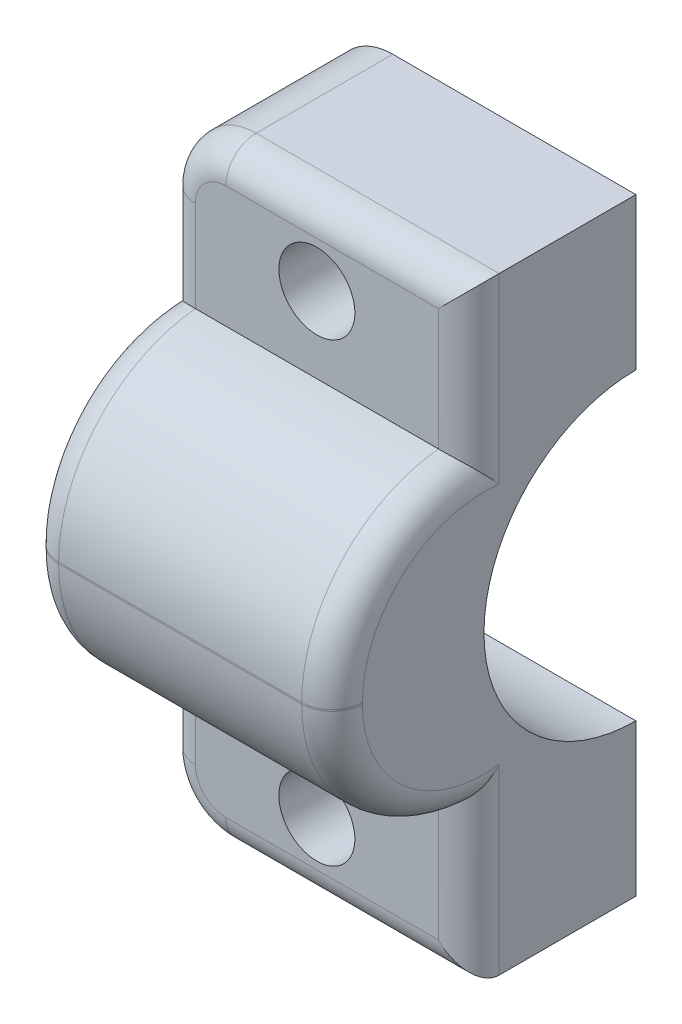
ISO-10303-21;
HEADER;
FILE_DESCRIPTION(('STEP AP214'),'2;1');
FILE_NAME('part.step','',(''),(''),'','','');
FILE_SCHEMA(('AUTOMOTIVE_DESIGN { 1 0 10303 214 1 1 1 1 }'));
ENDSEC;
DATA;
#1=APPLICATION_CONTEXT('core data for automotive mechanical design processes');
#2=APPLICATION_PROTOCOL_DEFINITION('international standard','automotive_design',2000,#1);
#3=PRODUCT_CONTEXT('',#1,'mechanical');
#4=PRODUCT('Part','Part','',(#3));
#5=PRODUCT_RELATED_PRODUCT_CATEGORY('part','',(#4));
#6=PRODUCT_DEFINITION_FORMATION('','',#4);
#7=PRODUCT_DEFINITION_CONTEXT('part definition',#1,'design');
#8=PRODUCT_DEFINITION('design','',#6,#7);
#9=PRODUCT_DEFINITION_SHAPE('','',#8);
#10=(LENGTH_UNIT() NAMED_UNIT(*) SI_UNIT(.MILLI.,.METRE.));
#11=(NAMED_UNIT(*) PLANE_ANGLE_UNIT() SI_UNIT($,.RADIAN.));
#12=(NAMED_UNIT(*) SI_UNIT($,.STERADIAN.) SOLID_ANGLE_UNIT());
#13=UNCERTAINTY_MEASURE_WITH_UNIT(LENGTH_MEASURE(1.E-05),#10,'distance_accuracy_value','');
#14=(GEOMETRIC_REPRESENTATION_CONTEXT(3) GLOBAL_UNCERTAINTY_ASSIGNED_CONTEXT((#13)) GLOBAL_UNIT_ASSIGNED_CONTEXT((#10,
#11,#12)) REPRESENTATION_CONTEXT('',''));
#15=CARTESIAN_POINT('',(0.,0.,0.));
#16=DIRECTION('',(0.,0.,1.));
#17=DIRECTION('',(1.,0.,0.));
#18=AXIS2_PLACEMENT_3D('',#15,#16,#17);
#19=CARTESIAN_POINT('',(0.,0.,30.));
#20=DIRECTION('',(0.,0.,1.));
#21=DIRECTION('',(1.,0.,0.));
#22=AXIS2_PLACEMENT_3D('',#19,#20,#21);
#23=PLANE('',#22);
#24=DIRECTION('',(-1.,0.,0.));
#25=VECTOR('',#24,1.);
#26=CARTESIAN_POINT('',(-110.,0.0250628144669108,30.));
#27=LINE('',#26,#25);
#28=CARTESIAN_POINT('',(-101.,0.0250628144669108,30.));
#29=VERTEX_POINT('',#28);
#30=CARTESIAN_POINT('',(-109.,0.0250628144669108,30.));
#31=VERTEX_POINT('',#30);
#32=EDGE_CURVE('E196',#29,#31,#27,.T.);
#33=ORIENTED_EDGE('',*,*,#32,.T.);
#34=DIRECTION('',(0.,-1.,0.));
#35=VECTOR('',#34,1.);
#36=CARTESIAN_POINT('',(-109.,0.,30.));
#37=LINE('',#36,#35);
#38=CARTESIAN_POINT('',(-109.,-0.0250628144669108,30.));
#39=VERTEX_POINT('',#38);
#40=EDGE_CURVE('E277',#31,#39,#37,.T.);
#41=ORIENTED_EDGE('',*,*,#40,.T.);
#42=DIRECTION('',(-1.,0.,0.));
#43=VECTOR('',#42,1.);
#44=CARTESIAN_POINT('',(-100.,-0.0250628144669108,30.));
#45=LINE('',#44,#43);
#46=CARTESIAN_POINT('',(-101.,-0.0250628144669108,30.));
#47=VERTEX_POINT('',#46);
#48=EDGE_CURVE('E241',#39,#47,#45,.F.);
#49=ORIENTED_EDGE('',*,*,#48,.T.);
#50=DIRECTION('',(0.,1.,0.));
#51=VECTOR('',#50,1.);
#52=CARTESIAN_POINT('',(-101.,0.0250628144669116,30.));
#53=LINE('',#52,#51);
#54=EDGE_CURVE('E274',#47,#29,#53,.T.);
#55=ORIENTED_EDGE('',*,*,#54,.T.);
#56=EDGE_LOOP('',(#33,#41,#49,#55));
#57=FACE_BOUND('',#56,.T.);
#58=ADVANCED_FACE('F46',(#57),#23,.T.);
#59=CARTESIAN_POINT('',(-100.,10.,30.));
#60=DIRECTION('',(-1.,0.,0.));
#61=DIRECTION('',(0.,0.,1.));
#62=AXIS2_PLACEMENT_3D('',#59,#60,#61);
#63=PLANE('',#62);
#64=CARTESIAN_POINT('',(-100.,-0.0250628144669108,25.));
#65=DIRECTION('',(-1.,0.,0.));
#66=DIRECTION('',(0.,0.,1.));
#67=AXIS2_PLACEMENT_3D('',#64,#65,#66);
#68=CIRCLE('',#67,4.);
#69=CARTESIAN_POINT('',(-100.,-0.0250628144669108,29.));
#70=VERTEX_POINT('',#69);
#71=CARTESIAN_POINT('',(-100.,-3.99368978106381,24.5000000000001));
#72=VERTEX_POINT('',#71);
#73=EDGE_CURVE('E289',#70,#72,#68,.F.);
#74=ORIENTED_EDGE('',*,*,#73,.T.);
#75=DIRECTION('',(0.,-1.,0.));
#76=VECTOR('',#75,1.);
#77=CARTESIAN_POINT('',(-100.,10.,24.5000000000001));
#78=LINE('',#77,#76);
#79=CARTESIAN_POINT('',(-100.,-10.,24.5000000000001));
#80=VERTEX_POINT('',#79);
#81=EDGE_CURVE('E292',#72,#80,#78,.T.);
#82=ORIENTED_EDGE('',*,*,#81,.T.);
#83=DIRECTION('',(0.,0.,-1.));
#84=VECTOR('',#83,1.);
#85=CARTESIAN_POINT('',(-100.,-10.,30.));
#86=LINE('',#85,#84);
#87=CARTESIAN_POINT('',(-100.,-10.,20.));
#88=VERTEX_POINT('',#87);
#89=EDGE_CURVE('E216',#80,#88,#86,.T.);
#90=ORIENTED_EDGE('',*,*,#89,.T.);
#91=DIRECTION('',(0.,1.,0.));
#92=VECTOR('',#91,1.);
#93=CARTESIAN_POINT('',(-100.,10.,20.));
#94=LINE('',#93,#92);
#95=CARTESIAN_POINT('',(-100.,-5.,20.));
#96=VERTEX_POINT('',#95);
#97=EDGE_CURVE('E543',#88,#96,#94,.T.);
#98=ORIENTED_EDGE('',*,*,#97,.T.);
#99=CARTESIAN_POINT('',(-100.,0.,20.));
#100=DIRECTION('',(-1.,0.,0.));
#101=DIRECTION('',(0.,0.,1.));
#102=AXIS2_PLACEMENT_3D('',#99,#100,#101);
#103=CIRCLE('',#102,5.);
#104=CARTESIAN_POINT('',(-100.,5.,20.));
#105=VERTEX_POINT('',#104);
#106=EDGE_CURVE('E225',#96,#105,#103,.T.);
#107=ORIENTED_EDGE('',*,*,#106,.T.);
#108=CARTESIAN_POINT('',(-100.,10.,20.));
#109=VERTEX_POINT('',#108);
#110=EDGE_CURVE('E548',#105,#109,#94,.T.);
#111=ORIENTED_EDGE('',*,*,#110,.T.);
#112=DIRECTION('',(0.,0.,-1.));
#113=VECTOR('',#112,1.);
#114=CARTESIAN_POINT('',(-100.,10.,30.));
#115=LINE('',#114,#113);
#116=CARTESIAN_POINT('',(-100.,10.,24.5000000000001));
#117=VERTEX_POINT('',#116);
#118=EDGE_CURVE('E222',#117,#109,#115,.T.);
#119=ORIENTED_EDGE('',*,*,#118,.F.);
#120=DIRECTION('',(0.,1.,0.));
#121=VECTOR('',#120,1.);
#122=CARTESIAN_POINT('',(-100.,10.,24.5000000000001));
#123=LINE('',#122,#121);
#124=CARTESIAN_POINT('',(-100.,3.99368978106381,24.5000000000001));
#125=VERTEX_POINT('',#124);
#126=EDGE_CURVE('E280',#117,#125,#123,.F.);
#127=ORIENTED_EDGE('',*,*,#126,.T.);
#128=CARTESIAN_POINT('',(-100.,0.0250628144669108,25.));
#129=DIRECTION('',(-1.,0.,0.));
#130=DIRECTION('',(0.,0.,1.));
#131=AXIS2_PLACEMENT_3D('',#128,#129,#130);
#132=CIRCLE('',#131,4.);
#133=CARTESIAN_POINT('',(-100.,0.0250628144669108,29.));
#134=VERTEX_POINT('',#133);
#135=EDGE_CURVE('E283',#125,#134,#132,.F.);
#136=ORIENTED_EDGE('',*,*,#135,.T.);
#137=DIRECTION('',(0.,1.,0.));
#138=VECTOR('',#137,1.);
#139=CARTESIAN_POINT('',(-100.,-0.0250628144669108,29.));
#140=LINE('',#139,#138);
#141=EDGE_CURVE('E286',#134,#70,#140,.F.);
#142=ORIENTED_EDGE('',*,*,#141,.T.);
#143=EDGE_LOOP('',(#74,#82,#90,#98,#107,#111,#119,#127,#136,#142));
#144=FACE_BOUND('',#143,.T.);
#145=ADVANCED_FACE('F428',(#144),#63,.F.);
#146=CARTESIAN_POINT('',(-110.,-10.,0.));
#147=DIRECTION('',(-1.,0.,0.));
#148=DIRECTION('',(0.,0.,1.));
#149=AXIS2_PLACEMENT_3D('',#146,#147,#148);
#150=PLANE('',#149);
#151=DIRECTION('',(0.,0.,-1.));
#152=VECTOR('',#151,1.);
#153=CARTESIAN_POINT('',(-110.,-8.,0.));
#154=LINE('',#153,#152);
#155=CARTESIAN_POINT('',(-110.,-8.,20.));
#156=VERTEX_POINT('',#155);
#157=CARTESIAN_POINT('',(-110.,-8.,24.5000000000001));
#158=VERTEX_POINT('',#157);
#159=EDGE_CURVE('E203',#156,#158,#154,.F.);
#160=ORIENTED_EDGE('',*,*,#159,.T.);
#161=DIRECTION('',(0.,1.,0.));
#162=VECTOR('',#161,1.);
#163=CARTESIAN_POINT('',(-110.,-5.,24.5000000000001));
#164=LINE('',#163,#162);
#165=CARTESIAN_POINT('',(-110.,-3.99368978106381,24.5000000000001));
#166=VERTEX_POINT('',#165);
#167=EDGE_CURVE('E264',#158,#166,#164,.T.);
#168=ORIENTED_EDGE('',*,*,#167,.T.);
#169=CARTESIAN_POINT('',(-110.,-0.0250628144669108,25.));
#170=DIRECTION('',(-1.,0.,0.));
#171=DIRECTION('',(0.,0.,1.));
#172=AXIS2_PLACEMENT_3D('',#169,#170,#171);
#173=CIRCLE('',#172,4.);
#174=CARTESIAN_POINT('',(-110.,-0.0250628144669108,29.));
#175=VERTEX_POINT('',#174);
#176=EDGE_CURVE('E261',#166,#175,#173,.T.);
#177=ORIENTED_EDGE('',*,*,#176,.T.);
#178=DIRECTION('',(0.,-1.,0.));
#179=VECTOR('',#178,1.);
#180=CARTESIAN_POINT('',(-110.,-10.,29.));
#181=LINE('',#180,#179);
#182=CARTESIAN_POINT('',(-110.,0.0250628144669108,29.));
#183=VERTEX_POINT('',#182);
#184=EDGE_CURVE('E258',#175,#183,#181,.F.);
#185=ORIENTED_EDGE('',*,*,#184,.T.);
#186=CARTESIAN_POINT('',(-110.,0.0250628144669108,25.));
#187=DIRECTION('',(-1.,0.,0.));
#188=DIRECTION('',(0.,0.,1.));
#189=AXIS2_PLACEMENT_3D('',#186,#187,#188);
#190=CIRCLE('',#189,4.);
#191=CARTESIAN_POINT('',(-110.,3.99368978106381,24.5000000000001));
#192=VERTEX_POINT('',#191);
#193=EDGE_CURVE('E254',#183,#192,#190,.T.);
#194=ORIENTED_EDGE('',*,*,#193,.T.);
#195=DIRECTION('',(0.,-1.,0.));
#196=VECTOR('',#195,1.);
#197=CARTESIAN_POINT('',(-110.,8.,24.5000000000001));
#198=LINE('',#197,#196);
#199=CARTESIAN_POINT('',(-110.,8.,24.5000000000001));
#200=VERTEX_POINT('',#199);
#201=EDGE_CURVE('E251',#192,#200,#198,.F.);
#202=ORIENTED_EDGE('',*,*,#201,.T.);
#203=DIRECTION('',(0.,0.,-1.));
#204=VECTOR('',#203,1.);
#205=CARTESIAN_POINT('',(-110.,8.,0.));
#206=LINE('',#205,#204);
#207=CARTESIAN_POINT('',(-110.,8.,20.));
#208=VERTEX_POINT('',#207);
#209=EDGE_CURVE('E215',#200,#208,#206,.T.);
#210=ORIENTED_EDGE('',*,*,#209,.T.);
#211=DIRECTION('',(0.,1.,0.));
#212=VECTOR('',#211,1.);
#213=CARTESIAN_POINT('',(-110.,10.,20.));
#214=LINE('',#213,#212);
#215=CARTESIAN_POINT('',(-110.,5.,20.));
#216=VERTEX_POINT('',#215);
#217=EDGE_CURVE('E210',#216,#208,#214,.T.);
#218=ORIENTED_EDGE('',*,*,#217,.F.);
#219=CARTESIAN_POINT('',(-110.,0.,20.));
#220=DIRECTION('',(-1.,0.,0.));
#221=DIRECTION('',(0.,0.,1.));
#222=AXIS2_PLACEMENT_3D('',#219,#220,#221);
#223=CIRCLE('',#222,5.);
#224=CARTESIAN_POINT('',(-110.,-5.,20.));
#225=VERTEX_POINT('',#224);
#226=EDGE_CURVE('E207',#225,#216,#223,.T.);
#227=ORIENTED_EDGE('',*,*,#226,.F.);
#228=EDGE_CURVE('E189',#156,#225,#214,.T.);
#229=ORIENTED_EDGE('',*,*,#228,.F.);
#230=EDGE_LOOP('',(#160,#168,#177,#185,#194,#202,#210,#218,#227,#229));
#231=FACE_BOUND('',#230,.T.);
#232=ADVANCED_FACE('F202',(#231),#150,.T.);
#233=CARTESIAN_POINT('',(-108.,8.,0.));
#234=DIRECTION('',(0.,0.,-1.));
#235=DIRECTION('',(-1.,0.,0.));
#236=AXIS2_PLACEMENT_3D('',#233,#234,#235);
#237=CYLINDRICAL_SURFACE('',#236,2.);
#238=ORIENTED_EDGE('',*,*,#209,.F.);
#239=CARTESIAN_POINT('',(-108.,8.,24.5000000000001));
#240=DIRECTION('',(0.,0.,-1.));
#241=DIRECTION('',(-1.,0.,0.));
#242=AXIS2_PLACEMENT_3D('',#239,#240,#241);
#243=CIRCLE('',#242,2.);
#244=CARTESIAN_POINT('',(-108.,10.,24.5000000000001));
#245=VERTEX_POINT('',#244);
#246=EDGE_CURVE('E310',#200,#245,#243,.T.);
#247=ORIENTED_EDGE('',*,*,#246,.T.);
#248=DIRECTION('',(0.,0.,-1.));
#249=VECTOR('',#248,1.);
#250=CARTESIAN_POINT('',(-108.,10.,0.));
#251=LINE('',#250,#249);
#252=CARTESIAN_POINT('',(-108.,10.,20.));
#253=VERTEX_POINT('',#252);
#254=EDGE_CURVE('E220',#253,#245,#251,.F.);
#255=ORIENTED_EDGE('',*,*,#254,.F.);
#256=CARTESIAN_POINT('',(-108.,8.,20.));
#257=DIRECTION('',(0.,0.,1.));
#258=DIRECTION('',(1.,0.,0.));
#259=AXIS2_PLACEMENT_3D('',#256,#257,#258);
#260=CIRCLE('',#259,2.);
#261=EDGE_CURVE('E551',#208,#253,#260,.F.);
#262=ORIENTED_EDGE('',*,*,#261,.F.);
#263=EDGE_LOOP('',(#238,#247,#255,#262));
#264=FACE_BOUND('',#263,.T.);
#265=ADVANCED_FACE('F448',(#264),#237,.T.);
#266=CARTESIAN_POINT('',(-108.,-8.,0.));
#267=DIRECTION('',(0.,0.,-1.));
#268=DIRECTION('',(-1.,0.,0.));
#269=AXIS2_PLACEMENT_3D('',#266,#267,#268);
#270=CYLINDRICAL_SURFACE('',#269,2.);
#271=DIRECTION('',(0.,0.,-1.));
#272=VECTOR('',#271,1.);
#273=CARTESIAN_POINT('',(-108.,-10.,0.));
#274=LINE('',#273,#272);
#275=CARTESIAN_POINT('',(-108.,-10.,24.5000000000001));
#276=VERTEX_POINT('',#275);
#277=CARTESIAN_POINT('',(-108.,-10.,20.));
#278=VERTEX_POINT('',#277);
#279=EDGE_CURVE('E197',#276,#278,#274,.T.);
#280=ORIENTED_EDGE('',*,*,#279,.F.);
#281=CARTESIAN_POINT('',(-108.,-8.,24.5000000000001));
#282=DIRECTION('',(0.,0.,-1.));
#283=DIRECTION('',(-1.,0.,0.));
#284=AXIS2_PLACEMENT_3D('',#281,#282,#283);
#285=CIRCLE('',#284,2.);
#286=EDGE_CURVE('E11',#276,#158,#285,.T.);
#287=ORIENTED_EDGE('',*,*,#286,.T.);
#288=ORIENTED_EDGE('',*,*,#159,.F.);
#289=CARTESIAN_POINT('',(-108.,-8.,20.));
#290=DIRECTION('',(0.,0.,1.));
#291=DIRECTION('',(1.,0.,0.));
#292=AXIS2_PLACEMENT_3D('',#289,#290,#291);
#293=CIRCLE('',#292,2.);
#294=EDGE_CURVE('E185',#278,#156,#293,.F.);
#295=ORIENTED_EDGE('',*,*,#294,.F.);
#296=EDGE_LOOP('',(#280,#287,#288,#295));
#297=FACE_BOUND('',#296,.T.);
#298=ADVANCED_FACE('F212',(#297),#270,.T.);
#299=CARTESIAN_POINT('',(-80.,0.,20.));
#300=DIRECTION('',(-1.,0.,0.));
#301=DIRECTION('',(0.,0.,1.));
#302=AXIS2_PLACEMENT_3D('',#299,#300,#301);
#303=CYLINDRICAL_SURFACE('',#302,5.);
#304=ORIENTED_EDGE('',*,*,#226,.T.);
#305=DIRECTION('',(-1.,0.,0.));
#306=VECTOR('',#305,1.);
#307=CARTESIAN_POINT('',(-80.,5.,20.));
#308=LINE('',#307,#306);
#309=EDGE_CURVE('E554',#216,#105,#308,.F.);
#310=ORIENTED_EDGE('',*,*,#309,.T.);
#311=ORIENTED_EDGE('',*,*,#106,.F.);
#312=DIRECTION('',(-1.,0.,0.));
#313=VECTOR('',#312,1.);
#314=CARTESIAN_POINT('',(-80.,-5.,20.));
#315=LINE('',#314,#313);
#316=EDGE_CURVE('E547',#96,#225,#315,.T.);
#317=ORIENTED_EDGE('',*,*,#316,.T.);
#318=EDGE_LOOP('',(#304,#310,#311,#317));
#319=FACE_BOUND('',#318,.T.);
#320=ADVANCED_FACE('F438',(#319),#303,.F.);
#321=CARTESIAN_POINT('',(-105.,-10.,0.));
#322=DIRECTION('',(0.,-1.,0.));
#323=DIRECTION('',(0.,0.,-1.));
#324=AXIS2_PLACEMENT_3D('',#321,#322,#323);
#325=PLANE('',#324);
#326=ORIENTED_EDGE('',*,*,#89,.F.);
#327=DIRECTION('',(-1.,0.,0.));
#328=VECTOR('',#327,1.);
#329=CARTESIAN_POINT('',(-108.,-10.,24.5000000000001));
#330=LINE('',#329,#328);
#331=EDGE_CURVE('E69',#80,#276,#330,.T.);
#332=ORIENTED_EDGE('',*,*,#331,.T.);
#333=ORIENTED_EDGE('',*,*,#279,.T.);
#334=DIRECTION('',(-1.,0.,0.));
#335=VECTOR('',#334,1.);
#336=CARTESIAN_POINT('',(-105.,-10.,20.));
#337=LINE('',#336,#335);
#338=EDGE_CURVE('E192',#88,#278,#337,.T.);
#339=ORIENTED_EDGE('',*,*,#338,.F.);
#340=EDGE_LOOP('',(#326,#332,#333,#339));
#341=FACE_BOUND('',#340,.T.);
#342=ADVANCED_FACE('F444',(#341),#325,.T.);
#343=CARTESIAN_POINT('',(-95.4801741761757,10.,0.));
#344=DIRECTION('',(0.,1.,0.));
#345=DIRECTION('',(0.,0.,1.));
#346=AXIS2_PLACEMENT_3D('',#343,#344,#345);
#347=PLANE('',#346);
#348=ORIENTED_EDGE('',*,*,#254,.T.);
#349=DIRECTION('',(-1.,0.,0.));
#350=VECTOR('',#349,1.);
#351=CARTESIAN_POINT('',(-100.,10.,24.5000000000001));
#352=LINE('',#351,#350);
#353=EDGE_CURVE('E307',#245,#117,#352,.F.);
#354=ORIENTED_EDGE('',*,*,#353,.T.);
#355=ORIENTED_EDGE('',*,*,#118,.T.);
#356=DIRECTION('',(1.,0.,0.));
#357=VECTOR('',#356,1.);
#358=CARTESIAN_POINT('',(-110.,10.,20.));
#359=LINE('',#358,#357);
#360=EDGE_CURVE('E209',#253,#109,#359,.T.);
#361=ORIENTED_EDGE('',*,*,#360,.F.);
#362=EDGE_LOOP('',(#348,#354,#355,#361));
#363=FACE_BOUND('',#362,.T.);
#364=ADVANCED_FACE('F441',(#363),#347,.T.);
#365=CARTESIAN_POINT('',(0.,0.,20.));
#366=DIRECTION('',(0.,0.,1.));
#367=DIRECTION('',(1.,0.,0.));
#368=AXIS2_PLACEMENT_3D('',#365,#366,#367);
#369=PLANE('',#368);
#370=CARTESIAN_POINT('',(-105.,-7.5,20.));
#371=DIRECTION('',(0.,0.,1.));
#372=DIRECTION('',(-1.,0.,0.));
#373=AXIS2_PLACEMENT_3D('',#370,#371,#372);
#374=CIRCLE('',#373,1.25);
#375=CARTESIAN_POINT('',(-106.25,-7.5,20.));
#376=VERTEX_POINT('',#375);
#377=EDGE_CURVE('E246',#376,#376,#374,.T.);
#378=ORIENTED_EDGE('',*,*,#377,.T.);
#379=EDGE_LOOP('',(#378));
#380=FACE_BOUND('',#379,.T.);
#381=ORIENTED_EDGE('',*,*,#97,.F.);
#382=ORIENTED_EDGE('',*,*,#338,.T.);
#383=ORIENTED_EDGE('',*,*,#294,.T.);
#384=ORIENTED_EDGE('',*,*,#228,.T.);
#385=ORIENTED_EDGE('',*,*,#316,.F.);
#386=EDGE_LOOP('',(#381,#382,#383,#384,#385));
#387=FACE_BOUND('',#386,.T.);
#388=ADVANCED_FACE('F188',(#380,#387),#369,.F.);
#389=CARTESIAN_POINT('',(-105.,7.5,20.));
#390=DIRECTION('',(0.,0.,-1.));
#391=DIRECTION('',(-1.,0.,0.));
#392=AXIS2_PLACEMENT_3D('',#389,#390,#391);
#393=CIRCLE('',#392,1.25);
#394=CARTESIAN_POINT('',(-106.25,7.5,20.));
#395=VERTEX_POINT('',#394);
#396=EDGE_CURVE('E236',#395,#395,#393,.T.);
#397=ORIENTED_EDGE('',*,*,#396,.F.);
#398=EDGE_LOOP('',(#397));
#399=FACE_BOUND('',#398,.T.);
#400=ORIENTED_EDGE('',*,*,#309,.F.);
#401=ORIENTED_EDGE('',*,*,#217,.T.);
#402=ORIENTED_EDGE('',*,*,#261,.T.);
#403=ORIENTED_EDGE('',*,*,#360,.T.);
#404=ORIENTED_EDGE('',*,*,#110,.F.);
#405=EDGE_LOOP('',(#400,#401,#402,#403,#404));
#406=FACE_BOUND('',#405,.T.);
#407=ADVANCED_FACE('F569',(#399,#406),#369,.F.);
#408=CARTESIAN_POINT('',(-105.,7.5,39.4999999999999));
#409=DIRECTION('',(0.,0.,-1.));
#410=DIRECTION('',(-1.,0.,0.));
#411=AXIS2_PLACEMENT_3D('',#408,#409,#410);
#412=CYLINDRICAL_SURFACE('',#411,1.25);
#413=CARTESIAN_POINT('',(-105.,7.5,25.5000000000001));
#414=DIRECTION('',(0.,0.,-1.));
#415=DIRECTION('',(-1.,0.,0.));
#416=AXIS2_PLACEMENT_3D('',#413,#414,#415);
#417=CIRCLE('',#416,1.25);
#418=CARTESIAN_POINT('',(-106.25,7.5,25.5000000000001));
#419=VERTEX_POINT('',#418);
#420=EDGE_CURVE('E232',#419,#419,#417,.F.);
#421=ORIENTED_EDGE('',*,*,#420,.T.);
#422=EDGE_LOOP('',(#421));
#423=FACE_BOUND('',#422,.T.);
#424=ORIENTED_EDGE('',*,*,#396,.T.);
#425=EDGE_LOOP('',(#424));
#426=FACE_BOUND('',#425,.T.);
#427=ADVANCED_FACE('F714',(#423,#426),#412,.F.);
#428=CARTESIAN_POINT('',(0.,0.,25.5000000000001));
#429=DIRECTION('',(0.,0.,-1.));
#430=DIRECTION('',(-1.,0.,0.));
#431=AXIS2_PLACEMENT_3D('',#428,#429,#430);
#432=PLANE('',#431);
#433=DIRECTION('',(1.,0.,0.));
#434=VECTOR('',#433,1.);
#435=CARTESIAN_POINT('',(-110.,5.,25.5000000000001));
#436=LINE('',#435,#434);
#437=CARTESIAN_POINT('',(-109.,5.,25.5000000000001));
#438=VERTEX_POINT('',#437);
#439=CARTESIAN_POINT('',(-101.,5.,25.5000000000001));
#440=VERTEX_POINT('',#439);
#441=EDGE_CURVE('E237',#438,#440,#436,.T.);
#442=ORIENTED_EDGE('',*,*,#441,.T.);
#443=DIRECTION('',(0.,1.,0.));
#444=VECTOR('',#443,1.);
#445=CARTESIAN_POINT('',(-101.,0.,25.5000000000001));
#446=LINE('',#445,#444);
#447=CARTESIAN_POINT('',(-101.,9.,25.5000000000001));
#448=VERTEX_POINT('',#447);
#449=EDGE_CURVE('E304',#440,#448,#446,.T.);
#450=ORIENTED_EDGE('',*,*,#449,.T.);
#451=DIRECTION('',(-1.,0.,0.));
#452=VECTOR('',#451,1.);
#453=CARTESIAN_POINT('',(-108.,9.,25.5000000000001));
#454=LINE('',#453,#452);
#455=CARTESIAN_POINT('',(-108.,9.,25.5000000000001));
#456=VERTEX_POINT('',#455);
#457=EDGE_CURVE('E301',#448,#456,#454,.T.);
#458=ORIENTED_EDGE('',*,*,#457,.T.);
#459=CARTESIAN_POINT('',(-108.,8.,25.5000000000001));
#460=DIRECTION('',(0.,0.,-1.));
#461=DIRECTION('',(-1.,0.,0.));
#462=AXIS2_PLACEMENT_3D('',#459,#460,#461);
#463=CIRCLE('',#462,1.);
#464=CARTESIAN_POINT('',(-109.,8.,25.5000000000001));
#465=VERTEX_POINT('',#464);
#466=EDGE_CURVE('E298',#456,#465,#463,.F.);
#467=ORIENTED_EDGE('',*,*,#466,.T.);
#468=DIRECTION('',(0.,-1.,0.));
#469=VECTOR('',#468,1.);
#470=CARTESIAN_POINT('',(-109.,5.,25.5000000000001));
#471=LINE('',#470,#469);
#472=EDGE_CURVE('E295',#465,#438,#471,.T.);
#473=ORIENTED_EDGE('',*,*,#472,.T.);
#474=EDGE_LOOP('',(#442,#450,#458,#467,#473));
#475=FACE_BOUND('',#474,.T.);
#476=ORIENTED_EDGE('',*,*,#420,.F.);
#477=EDGE_LOOP('',(#476));
#478=FACE_BOUND('',#477,.T.);
#479=ADVANCED_FACE('F459',(#475,#478),#432,.F.);
#480=CARTESIAN_POINT('',(-110.,0.0250628144669108,25.));
#481=DIRECTION('',(1.,0.,0.));
#482=DIRECTION('',(0.,0.,-1.));
#483=AXIS2_PLACEMENT_3D('',#480,#481,#482);
#484=CYLINDRICAL_SURFACE('',#483,5.);
#485=ORIENTED_EDGE('',*,*,#441,.F.);
#486=CARTESIAN_POINT('',(-109.,0.0250628144669108,25.));
#487=DIRECTION('',(-1.,0.,0.));
#488=DIRECTION('',(0.,0.,1.));
#489=AXIS2_PLACEMENT_3D('',#486,#487,#488);
#490=CIRCLE('',#489,5.);
#491=EDGE_CURVE('E270',#438,#31,#490,.F.);
#492=ORIENTED_EDGE('',*,*,#491,.T.);
#493=ORIENTED_EDGE('',*,*,#32,.F.);
#494=CARTESIAN_POINT('',(-101.,0.0250628144669108,25.));
#495=DIRECTION('',(-1.,0.,0.));
#496=DIRECTION('',(0.,0.,1.));
#497=AXIS2_PLACEMENT_3D('',#494,#495,#496);
#498=CIRCLE('',#497,5.);
#499=EDGE_CURVE('E267',#29,#440,#498,.T.);
#500=ORIENTED_EDGE('',*,*,#499,.T.);
#501=EDGE_LOOP('',(#485,#492,#493,#500));
#502=FACE_BOUND('',#501,.T.);
#503=ADVANCED_FACE('F456',(#502),#484,.T.);
#504=CARTESIAN_POINT('',(-105.,-7.5,39.4999999999999));
#505=DIRECTION('',(0.,0.,-1.));
#506=DIRECTION('',(-1.,0.,0.));
#507=AXIS2_PLACEMENT_3D('',#504,#505,#506);
#508=CYLINDRICAL_SURFACE('',#507,1.25);
#509=CARTESIAN_POINT('',(-105.,-7.5,25.5000000000001));
#510=DIRECTION('',(0.,0.,-1.));
#511=DIRECTION('',(-1.,0.,0.));
#512=AXIS2_PLACEMENT_3D('',#509,#510,#511);
#513=CIRCLE('',#512,1.25);
#514=CARTESIAN_POINT('',(-106.25,-7.5,25.5000000000001));
#515=VERTEX_POINT('',#514);
#516=EDGE_CURVE('E242',#515,#515,#513,.T.);
#517=ORIENTED_EDGE('',*,*,#516,.F.);
#518=EDGE_LOOP('',(#517));
#519=FACE_BOUND('',#518,.T.);
#520=ORIENTED_EDGE('',*,*,#377,.F.);
#521=EDGE_LOOP('',(#520));
#522=FACE_BOUND('',#521,.T.);
#523=ADVANCED_FACE('F458',(#519,#522),#508,.F.);
#524=CARTESIAN_POINT('',(0.,0.,25.5000000000001));
#525=DIRECTION('',(0.,0.,-1.));
#526=DIRECTION('',(-1.,0.,0.));
#527=AXIS2_PLACEMENT_3D('',#524,#525,#526);
#528=PLANE('',#527);
#529=DIRECTION('',(-1.,0.,0.));
#530=VECTOR('',#529,1.);
#531=CARTESIAN_POINT('',(-100.,-9.,25.5000000000001));
#532=LINE('',#531,#530);
#533=CARTESIAN_POINT('',(-108.,-9.,25.5000000000001));
#534=VERTEX_POINT('',#533);
#535=CARTESIAN_POINT('',(-101.,-9.,25.5000000000001));
#536=VERTEX_POINT('',#535);
#537=EDGE_CURVE('E77',#534,#536,#532,.F.);
#538=ORIENTED_EDGE('',*,*,#537,.T.);
#539=DIRECTION('',(0.,-1.,0.));
#540=VECTOR('',#539,1.);
#541=CARTESIAN_POINT('',(-101.,0.,25.5000000000001));
#542=LINE('',#541,#540);
#543=CARTESIAN_POINT('',(-101.,-5.,25.5000000000001));
#544=VERTEX_POINT('',#543);
#545=EDGE_CURVE('E321',#536,#544,#542,.F.);
#546=ORIENTED_EDGE('',*,*,#545,.T.);
#547=DIRECTION('',(1.,0.,0.));
#548=VECTOR('',#547,1.);
#549=CARTESIAN_POINT('',(-110.,-5.,25.5000000000001));
#550=LINE('',#549,#548);
#551=CARTESIAN_POINT('',(-109.,-5.,25.5000000000001));
#552=VERTEX_POINT('',#551);
#553=EDGE_CURVE('E247',#552,#544,#550,.T.);
#554=ORIENTED_EDGE('',*,*,#553,.F.);
#555=DIRECTION('',(0.,1.,0.));
#556=VECTOR('',#555,1.);
#557=CARTESIAN_POINT('',(-109.,-8.,25.5000000000001));
#558=LINE('',#557,#556);
#559=CARTESIAN_POINT('',(-109.,-8.,25.5000000000001));
#560=VERTEX_POINT('',#559);
#561=EDGE_CURVE('E318',#552,#560,#558,.F.);
#562=ORIENTED_EDGE('',*,*,#561,.T.);
#563=CARTESIAN_POINT('',(-108.,-8.,25.5000000000001));
#564=DIRECTION('',(0.,0.,-1.));
#565=DIRECTION('',(-1.,0.,0.));
#566=AXIS2_PLACEMENT_3D('',#563,#564,#565);
#567=CIRCLE('',#566,1.);
#568=EDGE_CURVE('E313',#560,#534,#567,.F.);
#569=ORIENTED_EDGE('',*,*,#568,.T.);
#570=EDGE_LOOP('',(#538,#546,#554,#562,#569));
#571=FACE_BOUND('',#570,.T.);
#572=ORIENTED_EDGE('',*,*,#516,.T.);
#573=EDGE_LOOP('',(#572));
#574=FACE_BOUND('',#573,.T.);
#575=ADVANCED_FACE('F462',(#571,#574),#528,.F.);
#576=CARTESIAN_POINT('',(-110.,-0.0250628144669108,25.));
#577=DIRECTION('',(1.,0.,0.));
#578=DIRECTION('',(0.,0.,-1.));
#579=AXIS2_PLACEMENT_3D('',#576,#577,#578);
#580=CYLINDRICAL_SURFACE('',#579,5.);
#581=ORIENTED_EDGE('',*,*,#48,.F.);
#582=CARTESIAN_POINT('',(-109.,-0.0250628144669108,25.));
#583=DIRECTION('',(-1.,0.,0.));
#584=DIRECTION('',(0.,0.,1.));
#585=AXIS2_PLACEMENT_3D('',#582,#583,#584);
#586=CIRCLE('',#585,5.);
#587=EDGE_CURVE('E61',#39,#552,#586,.F.);
#588=ORIENTED_EDGE('',*,*,#587,.T.);
#589=ORIENTED_EDGE('',*,*,#553,.T.);
#590=CARTESIAN_POINT('',(-101.,-0.0250628144669108,25.));
#591=DIRECTION('',(-1.,0.,0.));
#592=DIRECTION('',(0.,0.,1.));
#593=AXIS2_PLACEMENT_3D('',#590,#591,#592);
#594=CIRCLE('',#593,5.);
#595=EDGE_CURVE('E326',#544,#47,#594,.T.);
#596=ORIENTED_EDGE('',*,*,#595,.T.);
#597=EDGE_LOOP('',(#581,#588,#589,#596));
#598=FACE_BOUND('',#597,.T.);
#599=ADVANCED_FACE('F424',(#598),#580,.T.);
#600=CARTESIAN_POINT('',(-101.,-0.0250628144669108,25.));
#601=DIRECTION('',(-1.,0.,0.));
#602=DIRECTION('',(0.,0.,1.));
#603=AXIS2_PLACEMENT_3D('',#600,#601,#602);
#604=TOROIDAL_SURFACE('',#603,4.,1.);
#605=CARTESIAN_POINT('',(-101.,-0.0250628144669108,29.));
#606=DIRECTION('',(0.,1.,0.));
#607=DIRECTION('',(0.,0.,1.));
#608=AXIS2_PLACEMENT_3D('',#605,#606,#607);
#609=CIRCLE('',#608,1.);
#610=EDGE_CURVE('E515',#47,#70,#609,.T.);
#611=ORIENTED_EDGE('',*,*,#610,.F.);
#612=ORIENTED_EDGE('',*,*,#595,.F.);
#613=CARTESIAN_POINT('',(-101.,-5.,25.5000000000001));
#614=CARTESIAN_POINT('',(-100.977110162105,-5.00000186756223,25.5000026216904));
#615=CARTESIAN_POINT('',(-100.954233589197,-4.99928853689766,25.4992133967849));
#616=CARTESIAN_POINT('',(-100.908687860737,-4.99645638334685,25.4960834412928));
#617=CARTESIAN_POINT('',(-100.886018589173,-4.99433840240971,25.4937436401241));
#618=CARTESIAN_POINT('',(-100.818910256414,-4.98595829234503,25.4844945947007));
#619=CARTESIAN_POINT('',(-100.775000473024,-4.97766907030296,25.4753545466628));
#620=CARTESIAN_POINT('',(-100.690047027506,-4.95619675446255,25.4517743560637));
#621=CARTESIAN_POINT('',(-100.64899785267,-4.94302340119996,25.4373447632058));
#622=CARTESIAN_POINT('',(-100.570387102361,-4.91243974372566,25.404024336901));
#623=CARTESIAN_POINT('',(-100.532831953216,-4.89502183764962,25.3851255009927));
#624=CARTESIAN_POINT('',(-100.449590938036,-4.85011073339305,25.3367144478962));
#625=CARTESIAN_POINT('',(-100.405494489249,-4.82120672162225,25.3057799988966));
#626=CARTESIAN_POINT('',(-100.324749308136,-4.75855917935667,25.2394446507424));
#627=CARTESIAN_POINT('',(-100.288113023756,-4.72480771788123,25.2040364436569));
#628=CARTESIAN_POINT('',(-100.210231025724,-4.6409080629516,25.1170781939058));
#629=CARTESIAN_POINT('',(-100.172037878055,-4.58921818316126,25.0642905386794));
#630=CARTESIAN_POINT('',(-100.107842678508,-4.48127116514065,24.9560962145755));
#631=CARTESIAN_POINT('',(-100.081858742064,-4.42500738455165,24.9006857873944));
#632=CARTESIAN_POINT('',(-100.040448244448,-4.30821180964613,24.7879871239936));
#633=CARTESIAN_POINT('',(-100.02524855146,-4.24761624662082,24.7306836628164));
#634=CARTESIAN_POINT('',(-100.005154900768,-4.12436433408365,24.6167202158394));
#635=CARTESIAN_POINT('',(-100.000243325412,-4.06171169439552,24.5600592955438));
#636=CARTESIAN_POINT('',(-100.000002943921,-3.9968640807431,24.5028003050478));
#637=CARTESIAN_POINT('',(-100.000000004565,-3.99527711852751,24.5013998958416));
#638=CARTESIAN_POINT('',(-100.,-3.99368978106381,24.5000000000001));
#639=B_SPLINE_CURVE_WITH_KNOTS('',3,(#613,#614,#615,#616,#617,#618,#619,#620,#621,#622,#623,
#624,#625,#626,#627,#628,#629,#630,#631,#632,#633,#634,#635,#636,#637,#638),.UNSPECIFIED.,.F.,
.F.,(4,2,2,2,2,2,2,2,2,2,2,2,4),(0.,0.0686194406815414,0.13719778791539,0.273260508783634,
0.409053323587152,0.545091150000749,0.727479265695479,0.910169262402652,1.1583238283205,
1.40684544025363,1.66045152865168,1.91362297888813,1.9199724900432),.UNSPECIFIED.);
#640=EDGE_CURVE('E51',#72,#544,#639,.F.);
#641=ORIENTED_EDGE('',*,*,#640,.F.);
#642=ORIENTED_EDGE('',*,*,#73,.F.);
#643=EDGE_LOOP('',(#611,#612,#641,#642));
#644=FACE_BOUND('',#643,.T.);
#645=ADVANCED_FACE('F48',(#644),#604,.T.);
#646=CARTESIAN_POINT('',(-101.,10.,24.5000000000001));
#647=DIRECTION('',(0.,-1.,0.));
#648=DIRECTION('',(0.,0.,-1.));
#649=AXIS2_PLACEMENT_3D('',#646,#647,#648);
#650=CYLINDRICAL_SURFACE('',#649,1.);
#651=ORIENTED_EDGE('',*,*,#640,.T.);
#652=ORIENTED_EDGE('',*,*,#545,.F.);
#653=CARTESIAN_POINT('',(-101.,-9.,24.5000000000001));
#654=DIRECTION('',(-0.707106781186547,-0.707106781186547,0.));
#655=DIRECTION('',(0.707106781186547,-0.707106781186547,0.));
#656=AXIS2_PLACEMENT_3D('',#653,#654,#655);
#657=ELLIPSE('',#656,1.41421356237309,1.);
#658=EDGE_CURVE('E508',#80,#536,#657,.T.);
#659=ORIENTED_EDGE('',*,*,#658,.F.);
#660=ORIENTED_EDGE('',*,*,#81,.F.);
#661=EDGE_LOOP('',(#651,#652,#659,#660));
#662=FACE_BOUND('',#661,.T.);
#663=ADVANCED_FACE('F416',(#662),#650,.T.);
#664=CARTESIAN_POINT('',(-101.,0.,29.));
#665=DIRECTION('',(0.,-1.,0.));
#666=DIRECTION('',(0.,0.,-1.));
#667=AXIS2_PLACEMENT_3D('',#664,#665,#666);
#668=CYLINDRICAL_SURFACE('',#667,1.);
#669=ORIENTED_EDGE('',*,*,#610,.T.);
#670=ORIENTED_EDGE('',*,*,#141,.F.);
#671=CARTESIAN_POINT('',(-101.,0.0250628144669108,29.));
#672=DIRECTION('',(0.,1.,0.));
#673=DIRECTION('',(0.,0.,1.));
#674=AXIS2_PLACEMENT_3D('',#671,#672,#673);
#675=CIRCLE('',#674,1.);
#676=EDGE_CURVE('E505',#29,#134,#675,.T.);
#677=ORIENTED_EDGE('',*,*,#676,.F.);
#678=ORIENTED_EDGE('',*,*,#54,.F.);
#679=EDGE_LOOP('',(#669,#670,#677,#678));
#680=FACE_BOUND('',#679,.T.);
#681=ADVANCED_FACE('F413',(#680),#668,.T.);
#682=CARTESIAN_POINT('',(-105.,-9.,24.5000000000001));
#683=DIRECTION('',(1.,0.,0.));
#684=DIRECTION('',(0.,0.,-1.));
#685=AXIS2_PLACEMENT_3D('',#682,#683,#684);
#686=CYLINDRICAL_SURFACE('',#685,1.);
#687=ORIENTED_EDGE('',*,*,#658,.T.);
#688=ORIENTED_EDGE('',*,*,#537,.F.);
#689=CARTESIAN_POINT('',(-108.,-9.,24.5000000000001));
#690=DIRECTION('',(-1.,0.,0.));
#691=DIRECTION('',(0.,0.,1.));
#692=AXIS2_PLACEMENT_3D('',#689,#690,#691);
#693=CIRCLE('',#692,1.);
#694=EDGE_CURVE('E397',#276,#534,#693,.T.);
#695=ORIENTED_EDGE('',*,*,#694,.F.);
#696=ORIENTED_EDGE('',*,*,#331,.F.);
#697=EDGE_LOOP('',(#687,#688,#695,#696));
#698=FACE_BOUND('',#697,.T.);
#699=ADVANCED_FACE('F410',(#698),#686,.T.);
#700=CARTESIAN_POINT('',(-101.,0.0250628144669108,25.));
#701=DIRECTION('',(-1.,0.,0.));
#702=DIRECTION('',(0.,0.,1.));
#703=AXIS2_PLACEMENT_3D('',#700,#701,#702);
#704=TOROIDAL_SURFACE('',#703,4.,1.);
#705=ORIENTED_EDGE('',*,*,#676,.T.);
#706=ORIENTED_EDGE('',*,*,#135,.F.);
#707=CARTESIAN_POINT('',(-101.,5.,25.5000000000001));
#708=CARTESIAN_POINT('',(-100.977110162105,5.00000186756223,25.5000026216904));
#709=CARTESIAN_POINT('',(-100.954233589197,4.99928853689766,25.4992133967849));
#710=CARTESIAN_POINT('',(-100.908687860737,4.99645638334685,25.4960834412928));
#711=CARTESIAN_POINT('',(-100.886018589173,4.99433840240971,25.4937436401241));
#712=CARTESIAN_POINT('',(-100.818910256414,4.98595829234503,25.4844945947007));
#713=CARTESIAN_POINT('',(-100.775000473024,4.97766907030296,25.4753545466628));
#714=CARTESIAN_POINT('',(-100.690047027506,4.95619675446255,25.4517743560637));
#715=CARTESIAN_POINT('',(-100.64899785267,4.94302340119996,25.4373447632058));
#716=CARTESIAN_POINT('',(-100.570387102361,4.91243974372566,25.404024336901));
#717=CARTESIAN_POINT('',(-100.532831953216,4.89502183764962,25.3851255009927));
#718=CARTESIAN_POINT('',(-100.449590938036,4.85011073339305,25.3367144478962));
#719=CARTESIAN_POINT('',(-100.405494489249,4.82120672162225,25.3057799988966));
#720=CARTESIAN_POINT('',(-100.324749308136,4.75855917935667,25.2394446507424));
#721=CARTESIAN_POINT('',(-100.288113023756,4.72480771788123,25.2040364436569));
#722=CARTESIAN_POINT('',(-100.210231025724,4.6409080629516,25.1170781939058));
#723=CARTESIAN_POINT('',(-100.172037878055,4.58921818316126,25.0642905386794));
#724=CARTESIAN_POINT('',(-100.107842678508,4.48127116514065,24.9560962145755));
#725=CARTESIAN_POINT('',(-100.081858742064,4.42500738455165,24.9006857873944));
#726=CARTESIAN_POINT('',(-100.040448244448,4.30821180964613,24.7879871239936));
#727=CARTESIAN_POINT('',(-100.02524855146,4.24761624662082,24.7306836628164));
#728=CARTESIAN_POINT('',(-100.005154900768,4.12436433408365,24.6167202158394));
#729=CARTESIAN_POINT('',(-100.000243325412,4.06171169439552,24.5600592955438));
#730=CARTESIAN_POINT('',(-100.000002943921,3.9968640807431,24.5028003050478));
#731=CARTESIAN_POINT('',(-100.000000004565,3.99527711852751,24.5013998958416));
#732=CARTESIAN_POINT('',(-100.,3.99368978106381,24.5000000000001));
#733=B_SPLINE_CURVE_WITH_KNOTS('',3,(#707,#708,#709,#710,#711,#712,#713,#714,#715,#716,#717,
#718,#719,#720,#721,#722,#723,#724,#725,#726,#727,#728,#729,#730,#731,#732),.UNSPECIFIED.,.F.,
.F.,(4,2,2,2,2,2,2,2,2,2,2,2,4),(0.,0.0686194406815414,0.13719778791539,0.273260508783634,
0.409053323587152,0.545091150000749,0.727479265695479,0.910169262402652,1.1583238283205,
1.40684544025363,1.66045152865168,1.91362297888813,1.9199724900432),.UNSPECIFIED.);
#734=EDGE_CURVE('E387',#440,#125,#733,.T.);
#735=ORIENTED_EDGE('',*,*,#734,.F.);
#736=ORIENTED_EDGE('',*,*,#499,.F.);
#737=EDGE_LOOP('',(#705,#706,#735,#736));
#738=FACE_BOUND('',#737,.T.);
#739=ADVANCED_FACE('F399',(#738),#704,.T.);
#740=CARTESIAN_POINT('',(-108.,-8.,24.5000000000001));
#741=DIRECTION('',(0.,0.,-1.));
#742=DIRECTION('',(-1.,0.,0.));
#743=AXIS2_PLACEMENT_3D('',#740,#741,#742);
#744=DEGENERATE_TOROIDAL_SURFACE('',#743,1.,1.,.T.);
#745=ORIENTED_EDGE('',*,*,#694,.T.);
#746=ORIENTED_EDGE('',*,*,#568,.F.);
#747=CARTESIAN_POINT('',(-109.,-8.,24.5000000000001));
#748=DIRECTION('',(0.,1.,0.));
#749=DIRECTION('',(0.,0.,1.));
#750=AXIS2_PLACEMENT_3D('',#747,#748,#749);
#751=CIRCLE('',#750,1.);
#752=EDGE_CURVE('E383',#158,#560,#751,.T.);
#753=ORIENTED_EDGE('',*,*,#752,.F.);
#754=ORIENTED_EDGE('',*,*,#286,.F.);
#755=EDGE_LOOP('',(#745,#746,#753,#754));
#756=FACE_BOUND('',#755,.T.);
#757=ADVANCED_FACE('F405',(#756),#744,.T.);
#758=CARTESIAN_POINT('',(-101.,0.,24.5000000000001));
#759=DIRECTION('',(0.,1.,0.));
#760=DIRECTION('',(0.,0.,1.));
#761=AXIS2_PLACEMENT_3D('',#758,#759,#760);
#762=CYLINDRICAL_SURFACE('',#761,1.);
#763=ORIENTED_EDGE('',*,*,#734,.T.);
#764=ORIENTED_EDGE('',*,*,#126,.F.);
#765=CARTESIAN_POINT('',(-101.,9.,24.5000000000001));
#766=DIRECTION('',(-0.707106781186547,0.707106781186547,0.));
#767=DIRECTION('',(0.707106781186547,0.707106781186547,0.));
#768=AXIS2_PLACEMENT_3D('',#765,#766,#767);
#769=ELLIPSE('',#768,1.41421356237309,1.);
#770=EDGE_CURVE('E377',#448,#117,#769,.T.);
#771=ORIENTED_EDGE('',*,*,#770,.F.);
#772=ORIENTED_EDGE('',*,*,#449,.F.);
#773=EDGE_LOOP('',(#763,#764,#771,#772));
#774=FACE_BOUND('',#773,.T.);
#775=ADVANCED_FACE('F401',(#774),#762,.T.);
#776=CARTESIAN_POINT('',(-109.,-10.,24.5000000000001));
#777=DIRECTION('',(0.,-1.,0.));
#778=DIRECTION('',(0.,0.,-1.));
#779=AXIS2_PLACEMENT_3D('',#776,#777,#778);
#780=CYLINDRICAL_SURFACE('',#779,1.);
#781=ORIENTED_EDGE('',*,*,#752,.T.);
#782=ORIENTED_EDGE('',*,*,#561,.F.);
#783=CARTESIAN_POINT('',(-109.,-5.,25.5000000000001));
#784=CARTESIAN_POINT('',(-109.022889837895,-5.00000186756223,25.5000026216904));
#785=CARTESIAN_POINT('',(-109.045766410803,-4.99928853689766,25.4992133967849));
#786=CARTESIAN_POINT('',(-109.091312139263,-4.99645638334685,25.4960834412928));
#787=CARTESIAN_POINT('',(-109.113981410827,-4.99433840240972,25.4937436401241));
#788=CARTESIAN_POINT('',(-109.181089743586,-4.98595829234503,25.4844945947007));
#789=CARTESIAN_POINT('',(-109.224999526976,-4.97766907030296,25.4753545466628));
#790=CARTESIAN_POINT('',(-109.309952972494,-4.95619675446255,25.4517743560637));
#791=CARTESIAN_POINT('',(-109.35100214733,-4.94302340119996,25.4373447632058));
#792=CARTESIAN_POINT('',(-109.429612897639,-4.91243974372566,25.404024336901));
#793=CARTESIAN_POINT('',(-109.467168046784,-4.89502183764962,25.3851255009927));
#794=CARTESIAN_POINT('',(-109.550409061964,-4.85011073339305,25.3367144478962));
#795=CARTESIAN_POINT('',(-109.594505510751,-4.82120672162224,25.3057799988965));
#796=CARTESIAN_POINT('',(-109.675250691864,-4.75855917935666,25.2394446507424));
#797=CARTESIAN_POINT('',(-109.711886976244,-4.72480771788122,25.2040364436569));
#798=CARTESIAN_POINT('',(-109.789768974276,-4.6409080629516,25.1170781939058));
#799=CARTESIAN_POINT('',(-109.827962121945,-4.58921818316126,25.0642905386794));
#800=CARTESIAN_POINT('',(-109.892157321492,-4.48127116514065,24.9560962145755));
#801=CARTESIAN_POINT('',(-109.918141257936,-4.42500738455165,24.9006857873944));
#802=CARTESIAN_POINT('',(-109.959551755551,-4.30821180964613,24.7879871239936));
#803=CARTESIAN_POINT('',(-109.97475144854,-4.24761624662082,24.7306836628164));
#804=CARTESIAN_POINT('',(-109.994845099232,-4.12436433408365,24.6167202158394));
#805=CARTESIAN_POINT('',(-109.999756674588,-4.06171169439552,24.5600592955438));
#806=CARTESIAN_POINT('',(-109.999997056079,-3.9968640807431,24.5028003050478));
#807=CARTESIAN_POINT('',(-109.999999995435,-3.99527711852751,24.5013998958416));
#808=CARTESIAN_POINT('',(-110.,-3.99368978106381,24.5000000000001));
#809=B_SPLINE_CURVE_WITH_KNOTS('',3,(#783,#784,#785,#786,#787,#788,#789,#790,#791,#792,#793,
#794,#795,#796,#797,#798,#799,#800,#801,#802,#803,#804,#805,#806,#807,#808),.UNSPECIFIED.,.F.,
.F.,(4,2,2,2,2,2,2,2,2,2,2,2,4),(0.,0.0686194406815275,0.13719778791539,0.273260508783634,
0.409053323587152,0.545091150000749,0.727479265695504,0.910169262402651,1.1583238283205,
1.40684544025363,1.66045152865168,1.91362297888813,1.91997249004319),.UNSPECIFIED.);
#810=EDGE_CURVE('E368',#166,#552,#809,.F.);
#811=ORIENTED_EDGE('',*,*,#810,.F.);
#812=ORIENTED_EDGE('',*,*,#167,.F.);
#813=EDGE_LOOP('',(#781,#782,#811,#812));
#814=FACE_BOUND('',#813,.T.);
#815=ADVANCED_FACE('F364',(#814),#780,.T.);
#816=CARTESIAN_POINT('',(0.,9.,24.5000000000001));
#817=DIRECTION('',(1.,0.,0.));
#818=DIRECTION('',(0.,0.,-1.));
#819=AXIS2_PLACEMENT_3D('',#816,#817,#818);
#820=CYLINDRICAL_SURFACE('',#819,1.);
#821=ORIENTED_EDGE('',*,*,#770,.T.);
#822=ORIENTED_EDGE('',*,*,#353,.F.);
#823=CARTESIAN_POINT('',(-108.,9.,24.5000000000001));
#824=DIRECTION('',(-1.,0.,0.));
#825=DIRECTION('',(0.,0.,1.));
#826=AXIS2_PLACEMENT_3D('',#823,#824,#825);
#827=CIRCLE('',#826,1.);
#828=EDGE_CURVE('E378',#456,#245,#827,.T.);
#829=ORIENTED_EDGE('',*,*,#828,.F.);
#830=ORIENTED_EDGE('',*,*,#457,.F.);
#831=EDGE_LOOP('',(#821,#822,#829,#830));
#832=FACE_BOUND('',#831,.T.);
#833=ADVANCED_FACE('F362',(#832),#820,.T.);
#834=CARTESIAN_POINT('',(-109.,-0.0250628144669108,25.));
#835=DIRECTION('',(-1.,0.,0.));
#836=DIRECTION('',(0.,0.,1.));
#837=AXIS2_PLACEMENT_3D('',#834,#835,#836);
#838=TOROIDAL_SURFACE('',#837,4.,1.);
#839=ORIENTED_EDGE('',*,*,#810,.T.);
#840=ORIENTED_EDGE('',*,*,#587,.F.);
#841=CARTESIAN_POINT('',(-109.,-0.0250628144669108,29.));
#842=DIRECTION('',(0.,1.,0.));
#843=DIRECTION('',(0.,0.,1.));
#844=AXIS2_PLACEMENT_3D('',#841,#842,#843);
#845=CIRCLE('',#844,1.);
#846=EDGE_CURVE('E477',#175,#39,#845,.T.);
#847=ORIENTED_EDGE('',*,*,#846,.F.);
#848=ORIENTED_EDGE('',*,*,#176,.F.);
#849=EDGE_LOOP('',(#839,#840,#847,#848));
#850=FACE_BOUND('',#849,.T.);
#851=ADVANCED_FACE('F357',(#850),#838,.T.);
#852=CARTESIAN_POINT('',(-108.,8.,24.5000000000001));
#853=DIRECTION('',(0.,0.,-1.));
#854=DIRECTION('',(-1.,0.,0.));
#855=AXIS2_PLACEMENT_3D('',#852,#853,#854);
#856=DEGENERATE_TOROIDAL_SURFACE('',#855,1.,1.,.T.);
#857=ORIENTED_EDGE('',*,*,#828,.T.);
#858=ORIENTED_EDGE('',*,*,#246,.F.);
#859=CARTESIAN_POINT('',(-109.,8.,24.5000000000001));
#860=DIRECTION('',(0.,-1.,0.));
#861=DIRECTION('',(0.,0.,-1.));
#862=AXIS2_PLACEMENT_3D('',#859,#860,#861);
#863=CIRCLE('',#862,1.);
#864=EDGE_CURVE('E483',#465,#200,#863,.T.);
#865=ORIENTED_EDGE('',*,*,#864,.F.);
#866=ORIENTED_EDGE('',*,*,#466,.F.);
#867=EDGE_LOOP('',(#857,#858,#865,#866));
#868=FACE_BOUND('',#867,.T.);
#869=ADVANCED_FACE('F353',(#868),#856,.T.);
#870=CARTESIAN_POINT('',(-109.,0.,29.));
#871=DIRECTION('',(0.,-1.,0.));
#872=DIRECTION('',(0.,0.,-1.));
#873=AXIS2_PLACEMENT_3D('',#870,#871,#872);
#874=CYLINDRICAL_SURFACE('',#873,1.);
#875=ORIENTED_EDGE('',*,*,#846,.T.);
#876=ORIENTED_EDGE('',*,*,#40,.F.);
#877=CARTESIAN_POINT('',(-109.,0.0250628144669108,29.));
#878=DIRECTION('',(0.,1.,0.));
#879=DIRECTION('',(0.,0.,1.));
#880=AXIS2_PLACEMENT_3D('',#877,#878,#879);
#881=CIRCLE('',#880,1.);
#882=EDGE_CURVE('E340',#183,#31,#881,.T.);
#883=ORIENTED_EDGE('',*,*,#882,.F.);
#884=ORIENTED_EDGE('',*,*,#184,.F.);
#885=EDGE_LOOP('',(#875,#876,#883,#884));
#886=FACE_BOUND('',#885,.T.);
#887=ADVANCED_FACE('F350',(#886),#874,.T.);
#888=CARTESIAN_POINT('',(-109.,0.,24.5000000000001));
#889=DIRECTION('',(0.,1.,0.));
#890=DIRECTION('',(0.,0.,1.));
#891=AXIS2_PLACEMENT_3D('',#888,#889,#890);
#892=CYLINDRICAL_SURFACE('',#891,1.);
#893=ORIENTED_EDGE('',*,*,#864,.T.);
#894=ORIENTED_EDGE('',*,*,#201,.F.);
#895=CARTESIAN_POINT('',(-109.,5.,25.5000000000001));
#896=CARTESIAN_POINT('',(-109.022889837895,5.00000186756223,25.5000026216904));
#897=CARTESIAN_POINT('',(-109.045766410803,4.99928853689766,25.4992133967849));
#898=CARTESIAN_POINT('',(-109.091312139263,4.99645638334685,25.4960834412928));
#899=CARTESIAN_POINT('',(-109.113981410827,4.99433840240972,25.4937436401241));
#900=CARTESIAN_POINT('',(-109.181089743586,4.98595829234503,25.4844945947007));
#901=CARTESIAN_POINT('',(-109.224999526976,4.97766907030296,25.4753545466628));
#902=CARTESIAN_POINT('',(-109.309952972494,4.95619675446255,25.4517743560637));
#903=CARTESIAN_POINT('',(-109.35100214733,4.94302340119996,25.4373447632058));
#904=CARTESIAN_POINT('',(-109.429612897639,4.91243974372566,25.404024336901));
#905=CARTESIAN_POINT('',(-109.467168046784,4.89502183764962,25.3851255009927));
#906=CARTESIAN_POINT('',(-109.550409061964,4.85011073339305,25.3367144478962));
#907=CARTESIAN_POINT('',(-109.594505510751,4.82120672162224,25.3057799988965));
#908=CARTESIAN_POINT('',(-109.675250691864,4.75855917935666,25.2394446507424));
#909=CARTESIAN_POINT('',(-109.711886976244,4.72480771788122,25.2040364436569));
#910=CARTESIAN_POINT('',(-109.789768974276,4.6409080629516,25.1170781939058));
#911=CARTESIAN_POINT('',(-109.827962121945,4.58921818316126,25.0642905386794));
#912=CARTESIAN_POINT('',(-109.892157321492,4.48127116514065,24.9560962145755));
#913=CARTESIAN_POINT('',(-109.918141257936,4.42500738455165,24.9006857873944));
#914=CARTESIAN_POINT('',(-109.959551755551,4.30821180964613,24.7879871239936));
#915=CARTESIAN_POINT('',(-109.97475144854,4.24761624662082,24.7306836628164));
#916=CARTESIAN_POINT('',(-109.994845099232,4.12436433408365,24.6167202158394));
#917=CARTESIAN_POINT('',(-109.999756674588,4.06171169439552,24.5600592955438));
#918=CARTESIAN_POINT('',(-109.999997056079,3.9968640807431,24.5028003050478));
#919=CARTESIAN_POINT('',(-109.999999995435,3.99527711852751,24.5013998958416));
#920=CARTESIAN_POINT('',(-110.,3.99368978106381,24.5000000000001));
#921=B_SPLINE_CURVE_WITH_KNOTS('',3,(#895,#896,#897,#898,#899,#900,#901,#902,#903,#904,#905,
#906,#907,#908,#909,#910,#911,#912,#913,#914,#915,#916,#917,#918,#919,#920),.UNSPECIFIED.,.F.,
.F.,(4,2,2,2,2,2,2,2,2,2,2,2,4),(0.,0.0686194406815275,0.13719778791539,0.273260508783634,
0.409053323587152,0.545091150000749,0.727479265695504,0.910169262402651,1.1583238283205,
1.40684544025363,1.66045152865168,1.91362297888813,1.91997249004319),.UNSPECIFIED.);
#922=EDGE_CURVE('E331',#438,#192,#921,.T.);
#923=ORIENTED_EDGE('',*,*,#922,.F.);
#924=ORIENTED_EDGE('',*,*,#472,.F.);
#925=EDGE_LOOP('',(#893,#894,#923,#924));
#926=FACE_BOUND('',#925,.T.);
#927=ADVANCED_FACE('F342',(#926),#892,.T.);
#928=CARTESIAN_POINT('',(-109.,0.0250628144669108,25.));
#929=DIRECTION('',(-1.,0.,0.));
#930=DIRECTION('',(0.,0.,1.));
#931=AXIS2_PLACEMENT_3D('',#928,#929,#930);
#932=TOROIDAL_SURFACE('',#931,4.,1.);
#933=ORIENTED_EDGE('',*,*,#882,.T.);
#934=ORIENTED_EDGE('',*,*,#491,.F.);
#935=ORIENTED_EDGE('',*,*,#922,.T.);
#936=ORIENTED_EDGE('',*,*,#193,.F.);
#937=EDGE_LOOP('',(#933,#934,#935,#936));
#938=FACE_BOUND('',#937,.T.);
#939=ADVANCED_FACE('F345',(#938),#932,.T.);
#940=CLOSED_SHELL('',(#58,#145,#232,#265,#298,#320,#342,#364,#388,#407,#427,#479,#503,#523,#575,
#599,#645,#663,#681,#699,#739,#757,#775,#815,#833,#851,#869,#887,#927,#939));
#941=MANIFOLD_SOLID_BREP('B2',#940);
#942=ADVANCED_BREP_SHAPE_REPRESENTATION('',(#18,#941),#14);
#943=SHAPE_DEFINITION_REPRESENTATION(#9,#942);
ENDSEC;
END-ISO-10303-21;
